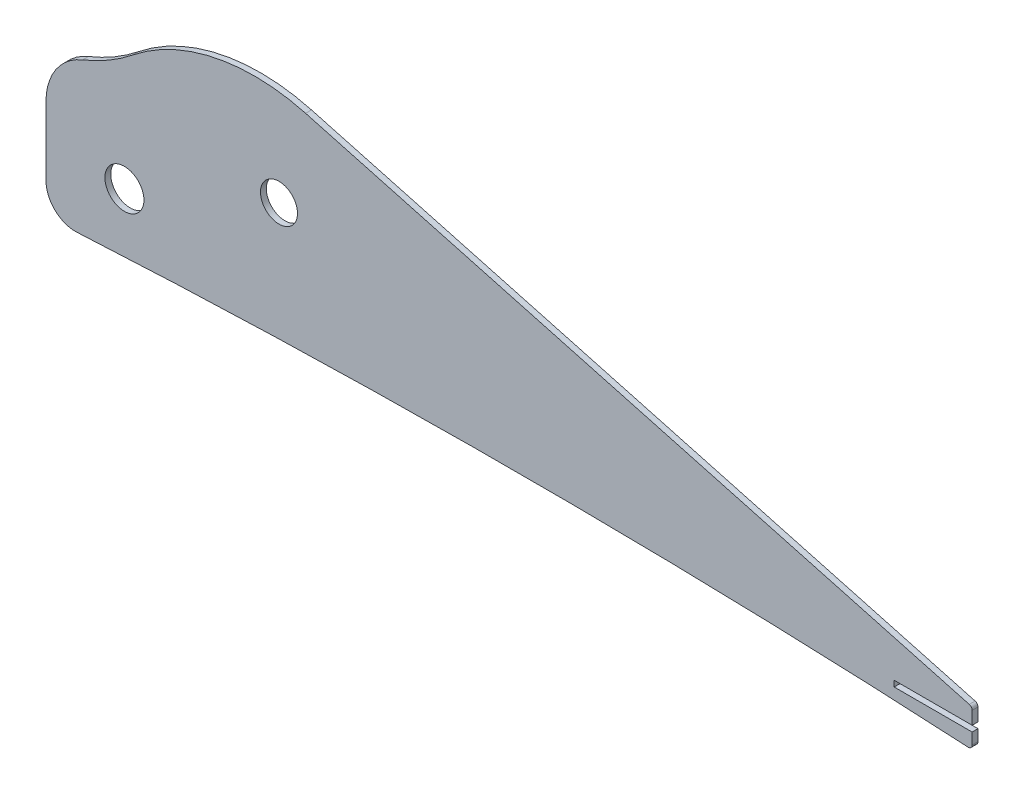
ISO-10303-21;
HEADER;
FILE_DESCRIPTION(('STEP AP214'),'2;1');
FILE_NAME('part.step','',(''),(''),'','','');
FILE_SCHEMA(('AUTOMOTIVE_DESIGN { 1 0 10303 214 1 1 1 1 }'));
ENDSEC;
DATA;
#1=APPLICATION_CONTEXT('core data for automotive mechanical design processes');
#2=APPLICATION_PROTOCOL_DEFINITION('international standard','automotive_design',2000,#1);
#3=PRODUCT_CONTEXT('',#1,'mechanical');
#4=PRODUCT('Part','Part','',(#3));
#5=PRODUCT_RELATED_PRODUCT_CATEGORY('part','',(#4));
#6=PRODUCT_DEFINITION_FORMATION('','',#4);
#7=PRODUCT_DEFINITION_CONTEXT('part definition',#1,'design');
#8=PRODUCT_DEFINITION('design','',#6,#7);
#9=PRODUCT_DEFINITION_SHAPE('','',#8);
#10=(LENGTH_UNIT() NAMED_UNIT(*) SI_UNIT(.MILLI.,.METRE.));
#11=(NAMED_UNIT(*) PLANE_ANGLE_UNIT() SI_UNIT($,.RADIAN.));
#12=(NAMED_UNIT(*) SI_UNIT($,.STERADIAN.) SOLID_ANGLE_UNIT());
#13=UNCERTAINTY_MEASURE_WITH_UNIT(LENGTH_MEASURE(1.E-05),#10,'distance_accuracy_value','');
#14=(GEOMETRIC_REPRESENTATION_CONTEXT(3) GLOBAL_UNCERTAINTY_ASSIGNED_CONTEXT((#13)) GLOBAL_UNIT_ASSIGNED_CONTEXT((#10,
#11,#12)) REPRESENTATION_CONTEXT('',''));
#15=CARTESIAN_POINT('',(0.,0.,0.));
#16=DIRECTION('',(0.,0.,1.));
#17=DIRECTION('',(1.,0.,0.));
#18=AXIS2_PLACEMENT_3D('',#15,#16,#17);
#19=CARTESIAN_POINT('',(450.000000000001,-42.109493016782,3.));
#20=DIRECTION('',(-1.,0.,0.));
#21=DIRECTION('',(0.,-1.,0.));
#22=AXIS2_PLACEMENT_3D('',#19,#20,#21);
#23=PLANE('',#22);
#24=DIRECTION('',(0.,1.,0.));
#25=VECTOR('',#24,1.);
#26=CARTESIAN_POINT('',(450.000000000001,-42.109493016782,0.));
#27=LINE('',#26,#25);
#28=CARTESIAN_POINT('',(450.000000000001,-42.109493016782,0.));
#29=VERTEX_POINT('',#28);
#30=CARTESIAN_POINT('',(450.000000000001,-36.3432898663785,0.));
#31=VERTEX_POINT('',#30);
#32=EDGE_CURVE('E186',#29,#31,#27,.T.);
#33=ORIENTED_EDGE('',*,*,#32,.T.);
#34=DIRECTION('',(0.,0.,1.));
#35=VECTOR('',#34,1.);
#36=CARTESIAN_POINT('',(450.000000000001,-36.3432898663785,0.));
#37=LINE('',#36,#35);
#38=CARTESIAN_POINT('',(450.000000000001,-36.3432898663785,3.));
#39=VERTEX_POINT('',#38);
#40=EDGE_CURVE('E249',#31,#39,#37,.T.);
#41=ORIENTED_EDGE('',*,*,#40,.T.);
#42=DIRECTION('',(0.,1.,0.));
#43=VECTOR('',#42,1.);
#44=CARTESIAN_POINT('',(450.000000000001,-42.109493016782,3.));
#45=LINE('',#44,#43);
#46=CARTESIAN_POINT('',(450.000000000001,-42.109493016782,3.));
#47=VERTEX_POINT('',#46);
#48=EDGE_CURVE('E150',#47,#39,#45,.T.);
#49=ORIENTED_EDGE('',*,*,#48,.F.);
#50=DIRECTION('',(0.,0.,-1.));
#51=VECTOR('',#50,1.);
#52=CARTESIAN_POINT('',(450.000000000001,-42.109493016782,3.));
#53=LINE('',#52,#51);
#54=EDGE_CURVE('E160',#47,#29,#53,.T.);
#55=ORIENTED_EDGE('',*,*,#54,.T.);
#56=EDGE_LOOP('',(#33,#41,#49,#55));
#57=FACE_BOUND('',#56,.T.);
#58=ADVANCED_FACE('F41',(#57),#23,.F.);
#59=CARTESIAN_POINT('',(81.9687686167285,-28.9584340125129,3.));
#60=DIRECTION('',(0.,0.,-1.));
#61=DIRECTION('',(-1.,0.,0.));
#62=AXIS2_PLACEMENT_3D('',#59,#60,#61);
#63=CYLINDRICAL_SURFACE('',#62,100.);
#64=CARTESIAN_POINT('',(81.9687686167285,-28.9584340125129,0.));
#65=DIRECTION('',(0.,0.,1.));
#66=DIRECTION('',(1.,0.,0.));
#67=AXIS2_PLACEMENT_3D('',#64,#65,#66);
#68=CIRCLE('',#67,100.);
#69=CARTESIAN_POINT('',(108.154123351422,67.5523280682947,0.));
#70=VERTEX_POINT('',#69);
#71=CARTESIAN_POINT('',(19.5156695534298,49.1415686596368,0.));
#72=VERTEX_POINT('',#71);
#73=EDGE_CURVE('E170',#70,#72,#68,.T.);
#74=ORIENTED_EDGE('',*,*,#73,.T.);
#75=DIRECTION('',(0.,0.,-1.));
#76=VECTOR('',#75,1.);
#77=CARTESIAN_POINT('',(19.5156695534298,49.1415686596368,3.));
#78=LINE('',#77,#76);
#79=CARTESIAN_POINT('',(19.5156695534298,49.1415686596368,3.));
#80=VERTEX_POINT('',#79);
#81=EDGE_CURVE('E11',#80,#72,#78,.T.);
#82=ORIENTED_EDGE('',*,*,#81,.F.);
#83=CARTESIAN_POINT('',(81.9687686167285,-28.9584340125129,3.));
#84=DIRECTION('',(0.,0.,1.));
#85=DIRECTION('',(1.,0.,0.));
#86=AXIS2_PLACEMENT_3D('',#83,#84,#85);
#87=CIRCLE('',#86,100.);
#88=CARTESIAN_POINT('',(108.154123351422,67.5523280682947,3.));
#89=VERTEX_POINT('',#88);
#90=EDGE_CURVE('E192',#89,#80,#87,.T.);
#91=ORIENTED_EDGE('',*,*,#90,.F.);
#92=DIRECTION('',(0.,0.,-1.));
#93=VECTOR('',#92,1.);
#94=CARTESIAN_POINT('',(108.154123351422,67.5523280682947,3.));
#95=LINE('',#94,#93);
#96=EDGE_CURVE('E165',#89,#70,#95,.T.);
#97=ORIENTED_EDGE('',*,*,#96,.T.);
#98=EDGE_LOOP('',(#74,#82,#91,#97));
#99=FACE_BOUND('',#98,.T.);
#100=ADVANCED_FACE('F43',(#99),#63,.T.);
#101=CARTESIAN_POINT('',(-44.8529201274795,129.63696602953,3.));
#102=DIRECTION('',(0.,0.,-1.));
#103=DIRECTION('',(-1.,0.,0.));
#104=AXIS2_PLACEMENT_3D('',#101,#102,#103);
#105=CYLINDRICAL_SURFACE('',#104,103.067086575911);
#106=CARTESIAN_POINT('',(-44.8529201274795,129.63696602953,0.));
#107=DIRECTION('',(0.,0.,-1.));
#108=DIRECTION('',(1.,0.,0.));
#109=AXIS2_PLACEMENT_3D('',#106,#107,#108);
#110=CIRCLE('',#109,103.067086575911);
#111=CARTESIAN_POINT('',(-6.23935033304476,34.0764272963448,0.));
#112=VERTEX_POINT('',#111);
#113=EDGE_CURVE('E173',#72,#112,#110,.T.);
#114=ORIENTED_EDGE('',*,*,#113,.T.);
#115=DIRECTION('',(0.,0.,-1.));
#116=VECTOR('',#115,1.);
#117=CARTESIAN_POINT('',(-6.23935033304476,34.0764272963448,3.));
#118=LINE('',#117,#116);
#119=CARTESIAN_POINT('',(-6.23935033304476,34.0764272963448,3.));
#120=VERTEX_POINT('',#119);
#121=EDGE_CURVE('E50',#120,#112,#118,.T.);
#122=ORIENTED_EDGE('',*,*,#121,.F.);
#123=CARTESIAN_POINT('',(-44.8529201274795,129.63696602953,3.));
#124=DIRECTION('',(0.,0.,-1.));
#125=DIRECTION('',(1.,0.,0.));
#126=AXIS2_PLACEMENT_3D('',#123,#124,#125);
#127=CIRCLE('',#126,103.067086575911);
#128=EDGE_CURVE('E113',#80,#120,#127,.T.);
#129=ORIENTED_EDGE('',*,*,#128,.F.);
#130=ORIENTED_EDGE('',*,*,#81,.T.);
#131=EDGE_LOOP('',(#114,#122,#129,#130));
#132=FACE_BOUND('',#131,.T.);
#133=ADVANCED_FACE('F279',(#132),#105,.F.);
#134=CARTESIAN_POINT('',(5.00000000000125,6.26137733969261,3.));
#135=DIRECTION('',(0.,0.,-1.));
#136=DIRECTION('',(-1.,0.,0.));
#137=AXIS2_PLACEMENT_3D('',#134,#135,#136);
#138=CYLINDRICAL_SURFACE('',#137,30.);
#139=CARTESIAN_POINT('',(5.00000000000125,6.26137733969261,0.));
#140=DIRECTION('',(0.,0.,1.));
#141=DIRECTION('',(1.,0.,0.));
#142=AXIS2_PLACEMENT_3D('',#139,#140,#141);
#143=CIRCLE('',#142,30.);
#144=CARTESIAN_POINT('',(-24.9999999999987,6.26137733969261,0.));
#145=VERTEX_POINT('',#144);
#146=EDGE_CURVE('E176',#112,#145,#143,.T.);
#147=ORIENTED_EDGE('',*,*,#146,.T.);
#148=DIRECTION('',(0.,0.,-1.));
#149=VECTOR('',#148,1.);
#150=CARTESIAN_POINT('',(-24.9999999999987,6.26137733969261,3.));
#151=LINE('',#150,#149);
#152=CARTESIAN_POINT('',(-24.9999999999987,6.26137733969261,3.));
#153=VERTEX_POINT('',#152);
#154=EDGE_CURVE('E206',#153,#145,#151,.T.);
#155=ORIENTED_EDGE('',*,*,#154,.F.);
#156=CARTESIAN_POINT('',(5.00000000000125,6.26137733969261,3.));
#157=DIRECTION('',(0.,0.,1.));
#158=DIRECTION('',(1.,0.,0.));
#159=AXIS2_PLACEMENT_3D('',#156,#157,#158);
#160=CIRCLE('',#159,30.);
#161=EDGE_CURVE('E215',#120,#153,#160,.T.);
#162=ORIENTED_EDGE('',*,*,#161,.F.);
#163=ORIENTED_EDGE('',*,*,#121,.T.);
#164=EDGE_LOOP('',(#147,#155,#162,#163));
#165=FACE_BOUND('',#164,.T.);
#166=ADVANCED_FACE('F213',(#165),#138,.T.);
#167=CARTESIAN_POINT('',(-24.9999999999987,-28.9651853696142,3.));
#168=DIRECTION('',(1.,0.,0.));
#169=DIRECTION('',(0.,0.,-1.));
#170=AXIS2_PLACEMENT_3D('',#167,#168,#169);
#171=PLANE('',#170);
#172=DIRECTION('',(0.,-1.,0.));
#173=VECTOR('',#172,1.);
#174=CARTESIAN_POINT('',(-24.9999999999987,-28.9651853696142,0.));
#175=LINE('',#174,#173);
#176=CARTESIAN_POINT('',(-24.9999999999988,-28.9651853696142,0.));
#177=VERTEX_POINT('',#176);
#178=EDGE_CURVE('E178',#145,#177,#175,.T.);
#179=ORIENTED_EDGE('',*,*,#178,.T.);
#180=DIRECTION('',(0.,0.,-1.));
#181=VECTOR('',#180,1.);
#182=CARTESIAN_POINT('',(-24.9999999999988,-28.9651853696142,3.));
#183=LINE('',#182,#181);
#184=CARTESIAN_POINT('',(-24.9999999999988,-28.9651853696142,3.));
#185=VERTEX_POINT('',#184);
#186=EDGE_CURVE('E203',#185,#177,#183,.T.);
#187=ORIENTED_EDGE('',*,*,#186,.F.);
#188=DIRECTION('',(0.,-1.,0.));
#189=VECTOR('',#188,1.);
#190=CARTESIAN_POINT('',(-24.9999999999987,-28.9651853696142,3.));
#191=LINE('',#190,#189);
#192=EDGE_CURVE('E233',#153,#185,#191,.T.);
#193=ORIENTED_EDGE('',*,*,#192,.F.);
#194=ORIENTED_EDGE('',*,*,#154,.T.);
#195=EDGE_LOOP('',(#179,#187,#193,#194));
#196=FACE_BOUND('',#195,.T.);
#197=ADVANCED_FACE('F224',(#196),#171,.F.);
#198=CARTESIAN_POINT('',(-9.99999999999876,-28.9651853696142,3.));
#199=DIRECTION('',(0.,0.,-1.));
#200=DIRECTION('',(-1.,0.,0.));
#201=AXIS2_PLACEMENT_3D('',#198,#199,#200);
#202=CYLINDRICAL_SURFACE('',#201,15.);
#203=CARTESIAN_POINT('',(-9.99999999999876,-28.9651853696142,0.));
#204=DIRECTION('',(0.,0.,1.));
#205=DIRECTION('',(-1.,0.,0.));
#206=AXIS2_PLACEMENT_3D('',#203,#204,#205);
#207=CIRCLE('',#206,15.);
#208=CARTESIAN_POINT('',(-9.16962043075212,-43.9421833922813,0.));
#209=VERTEX_POINT('',#208);
#210=EDGE_CURVE('E180',#177,#209,#207,.T.);
#211=ORIENTED_EDGE('',*,*,#210,.T.);
#212=DIRECTION('',(0.,0.,-1.));
#213=VECTOR('',#212,1.);
#214=CARTESIAN_POINT('',(-9.16962043075212,-43.9421833922813,3.));
#215=LINE('',#214,#213);
#216=CARTESIAN_POINT('',(-9.16962043075212,-43.9421833922813,3.));
#217=VERTEX_POINT('',#216);
#218=EDGE_CURVE('E200',#217,#209,#215,.T.);
#219=ORIENTED_EDGE('',*,*,#218,.F.);
#220=CARTESIAN_POINT('',(-9.99999999999876,-28.9651853696142,3.));
#221=DIRECTION('',(0.,0.,1.));
#222=DIRECTION('',(-1.,0.,0.));
#223=AXIS2_PLACEMENT_3D('',#220,#221,#222);
#224=CIRCLE('',#223,15.);
#225=EDGE_CURVE('E230',#185,#217,#224,.T.);
#226=ORIENTED_EDGE('',*,*,#225,.F.);
#227=ORIENTED_EDGE('',*,*,#186,.T.);
#228=EDGE_LOOP('',(#211,#219,#226,#227));
#229=FACE_BOUND('',#228,.T.);
#230=ADVANCED_FACE('F228',(#229),#202,.T.);
#231=CARTESIAN_POINT('',(217.888226405949,-4139.23191479768,3.));
#232=DIRECTION('',(0.,0.,-1.));
#233=DIRECTION('',(-1.,0.,0.));
#234=AXIS2_PLACEMENT_3D('',#231,#232,#233);
#235=CYLINDRICAL_SURFACE('',#234,4101.57936043722);
#236=CARTESIAN_POINT('',(217.888226405949,-4139.23191479768,0.));
#237=DIRECTION('',(0.,0.,-1.));
#238=DIRECTION('',(-1.,0.,0.));
#239=AXIS2_PLACEMENT_3D('',#236,#237,#238);
#240=CIRCLE('',#239,4101.57936043722);
#241=CARTESIAN_POINT('',(447.887848264464,-44.1063460379672,0.));
#242=VERTEX_POINT('',#241);
#243=EDGE_CURVE('E182',#209,#242,#240,.T.);
#244=ORIENTED_EDGE('',*,*,#243,.T.);
#245=DIRECTION('',(0.,0.,-1.));
#246=VECTOR('',#245,1.);
#247=CARTESIAN_POINT('',(447.887848264464,-44.1063460379672,3.));
#248=LINE('',#247,#246);
#249=CARTESIAN_POINT('',(447.887848264464,-44.1063460379672,3.));
#250=VERTEX_POINT('',#249);
#251=EDGE_CURVE('E197',#250,#242,#248,.T.);
#252=ORIENTED_EDGE('',*,*,#251,.F.);
#253=CARTESIAN_POINT('',(217.888226405949,-4139.23191479768,3.));
#254=DIRECTION('',(0.,0.,-1.));
#255=DIRECTION('',(-1.,0.,0.));
#256=AXIS2_PLACEMENT_3D('',#253,#254,#255);
#257=CIRCLE('',#256,4101.57936043722);
#258=EDGE_CURVE('E232',#217,#250,#257,.T.);
#259=ORIENTED_EDGE('',*,*,#258,.F.);
#260=ORIENTED_EDGE('',*,*,#218,.T.);
#261=EDGE_LOOP('',(#244,#252,#259,#260));
#262=FACE_BOUND('',#261,.T.);
#263=ADVANCED_FACE('F300',(#262),#235,.F.);
#264=CARTESIAN_POINT('',(448.000000000001,-42.109493016782,3.));
#265=DIRECTION('',(0.,0.,-1.));
#266=DIRECTION('',(-1.,0.,0.));
#267=AXIS2_PLACEMENT_3D('',#264,#265,#266);
#268=CYLINDRICAL_SURFACE('',#267,2.00000000000009);
#269=CARTESIAN_POINT('',(448.000000000001,-42.109493016782,0.));
#270=DIRECTION('',(0.,0.,1.));
#271=DIRECTION('',(1.,0.,0.));
#272=AXIS2_PLACEMENT_3D('',#269,#270,#271);
#273=CIRCLE('',#272,2.00000000000009);
#274=EDGE_CURVE('E184',#242,#29,#273,.T.);
#275=ORIENTED_EDGE('',*,*,#274,.T.);
#276=ORIENTED_EDGE('',*,*,#54,.F.);
#277=CARTESIAN_POINT('',(448.000000000001,-42.109493016782,3.));
#278=DIRECTION('',(0.,0.,1.));
#279=DIRECTION('',(1.,0.,0.));
#280=AXIS2_PLACEMENT_3D('',#277,#278,#279);
#281=CIRCLE('',#280,2.00000000000009);
#282=EDGE_CURVE('E151',#250,#47,#281,.T.);
#283=ORIENTED_EDGE('',*,*,#282,.F.);
#284=ORIENTED_EDGE('',*,*,#251,.T.);
#285=EDGE_LOOP('',(#275,#276,#283,#284));
#286=FACE_BOUND('',#285,.T.);
#287=ADVANCED_FACE('F243',(#286),#268,.T.);
#288=CARTESIAN_POINT('',(450.000000000001,-33.3432898663785,3.));
#289=VERTEX_POINT('',#288);
#290=CARTESIAN_POINT('',(450.000000000001,-26.7271557839573,3.));
#291=VERTEX_POINT('',#290);
#292=EDGE_CURVE('E136',#289,#291,#45,.T.);
#293=ORIENTED_EDGE('',*,*,#292,.F.);
#294=DIRECTION('',(0.,0.,1.));
#295=VECTOR('',#294,1.);
#296=CARTESIAN_POINT('',(450.000000000001,-33.3432898663785,0.));
#297=LINE('',#296,#295);
#298=CARTESIAN_POINT('',(450.000000000001,-33.3432898663785,0.));
#299=VERTEX_POINT('',#298);
#300=EDGE_CURVE('E269',#299,#289,#297,.T.);
#301=ORIENTED_EDGE('',*,*,#300,.F.);
#302=CARTESIAN_POINT('',(450.000000000001,-26.7271557839573,0.));
#303=VERTEX_POINT('',#302);
#304=EDGE_CURVE('E157',#299,#303,#27,.T.);
#305=ORIENTED_EDGE('',*,*,#304,.T.);
#306=DIRECTION('',(0.,0.,-1.));
#307=VECTOR('',#306,1.);
#308=CARTESIAN_POINT('',(450.000000000001,-26.7271557839573,3.));
#309=LINE('',#308,#307);
#310=EDGE_CURVE('E154',#291,#303,#309,.T.);
#311=ORIENTED_EDGE('',*,*,#310,.F.);
#312=EDGE_LOOP('',(#293,#301,#305,#311));
#313=FACE_BOUND('',#312,.T.);
#314=ADVANCED_FACE('F155',(#313),#23,.F.);
#315=CARTESIAN_POINT('',(448.000000000001,-26.7271557839573,3.));
#316=DIRECTION('',(0.,0.,-1.));
#317=DIRECTION('',(-1.,0.,0.));
#318=AXIS2_PLACEMENT_3D('',#315,#316,#317);
#319=CYLINDRICAL_SURFACE('',#318,2.);
#320=CARTESIAN_POINT('',(448.000000000001,-26.7271557839573,0.));
#321=DIRECTION('',(0.,0.,1.));
#322=DIRECTION('',(1.,0.,0.));
#323=AXIS2_PLACEMENT_3D('',#320,#321,#322);
#324=CIRCLE('',#323,2.);
#325=CARTESIAN_POINT('',(448.523707094695,-24.7969405423412,0.));
#326=VERTEX_POINT('',#325);
#327=EDGE_CURVE('E189',#303,#326,#324,.T.);
#328=ORIENTED_EDGE('',*,*,#327,.T.);
#329=DIRECTION('',(0.,0.,-1.));
#330=VECTOR('',#329,1.);
#331=CARTESIAN_POINT('',(448.523707094695,-24.7969405423412,3.));
#332=LINE('',#331,#330);
#333=CARTESIAN_POINT('',(448.523707094695,-24.7969405423412,3.));
#334=VERTEX_POINT('',#333);
#335=EDGE_CURVE('E161',#334,#326,#332,.T.);
#336=ORIENTED_EDGE('',*,*,#335,.F.);
#337=CARTESIAN_POINT('',(448.000000000001,-26.7271557839573,3.));
#338=DIRECTION('',(0.,0.,1.));
#339=DIRECTION('',(1.,0.,0.));
#340=AXIS2_PLACEMENT_3D('',#337,#338,#339);
#341=CIRCLE('',#340,2.);
#342=EDGE_CURVE('E142',#291,#334,#341,.T.);
#343=ORIENTED_EDGE('',*,*,#342,.F.);
#344=ORIENTED_EDGE('',*,*,#310,.T.);
#345=EDGE_LOOP('',(#328,#336,#343,#344));
#346=FACE_BOUND('',#345,.T.);
#347=ADVANCED_FACE('F163',(#346),#319,.T.);
#348=CARTESIAN_POINT('',(108.154123351422,67.5523280682947,3.));
#349=DIRECTION('',(-0.261853547346938,-0.965107620808076,0.));
#350=DIRECTION('',(0.965107620808076,-0.261853547346938,0.));
#351=AXIS2_PLACEMENT_3D('',#348,#349,#350);
#352=PLANE('',#351);
#353=DIRECTION('',(-0.965107620808076,0.261853547346938,0.));
#354=VECTOR('',#353,1.);
#355=CARTESIAN_POINT('',(108.154123351422,67.5523280682947,0.));
#356=LINE('',#355,#354);
#357=EDGE_CURVE('E105',#326,#70,#356,.T.);
#358=ORIENTED_EDGE('',*,*,#357,.T.);
#359=ORIENTED_EDGE('',*,*,#96,.F.);
#360=DIRECTION('',(-0.965107620808076,0.261853547346938,0.));
#361=VECTOR('',#360,1.);
#362=CARTESIAN_POINT('',(108.154123351422,67.5523280682947,3.));
#363=LINE('',#362,#361);
#364=EDGE_CURVE('E66',#334,#89,#363,.T.);
#365=ORIENTED_EDGE('',*,*,#364,.F.);
#366=ORIENTED_EDGE('',*,*,#335,.T.);
#367=EDGE_LOOP('',(#358,#359,#365,#366));
#368=FACE_BOUND('',#367,.T.);
#369=ADVANCED_FACE('F298',(#368),#352,.F.);
#370=CARTESIAN_POINT('',(81.9687686167285,-28.9584340125129,3.));
#371=DIRECTION('',(0.,0.,1.));
#372=DIRECTION('',(1.,0.,0.));
#373=AXIS2_PLACEMENT_3D('',#370,#371,#372);
#374=PLANE('',#373);
#375=CARTESIAN_POINT('',(15.2117765311485,-12.4749755970572,3.));
#376=DIRECTION('',(0.,0.,1.));
#377=DIRECTION('',(1.,0.,0.));
#378=AXIS2_PLACEMENT_3D('',#375,#376,#377);
#379=CIRCLE('',#378,10.);
#380=CARTESIAN_POINT('',(25.2117765311485,-12.4749755970572,3.));
#381=VERTEX_POINT('',#380);
#382=EDGE_CURVE('E421',#381,#381,#379,.T.);
#383=ORIENTED_EDGE('',*,*,#382,.F.);
#384=EDGE_LOOP('',(#383));
#385=FACE_BOUND('',#384,.T.);
#386=DIRECTION('',(1.,0.,0.));
#387=VECTOR('',#386,1.);
#388=CARTESIAN_POINT('',(450.000000000001,-36.3432898663785,3.));
#389=LINE('',#388,#387);
#390=CARTESIAN_POINT('',(410.000000000001,-36.3432898663785,3.));
#391=VERTEX_POINT('',#390);
#392=EDGE_CURVE('E265',#391,#39,#389,.T.);
#393=ORIENTED_EDGE('',*,*,#392,.F.);
#394=DIRECTION('',(0.,-1.,0.));
#395=VECTOR('',#394,1.);
#396=CARTESIAN_POINT('',(410.000000000001,-36.3432898663785,3.));
#397=LINE('',#396,#395);
#398=CARTESIAN_POINT('',(410.000000000001,-33.3432898663785,3.));
#399=VERTEX_POINT('',#398);
#400=EDGE_CURVE('E424',#399,#391,#397,.T.);
#401=ORIENTED_EDGE('',*,*,#400,.F.);
#402=DIRECTION('',(-1.,0.,0.));
#403=VECTOR('',#402,1.);
#404=CARTESIAN_POINT('',(450.000000000001,-33.3432898663785,3.));
#405=LINE('',#404,#403);
#406=EDGE_CURVE('E147',#289,#399,#405,.T.);
#407=ORIENTED_EDGE('',*,*,#406,.F.);
#408=ORIENTED_EDGE('',*,*,#292,.T.);
#409=ORIENTED_EDGE('',*,*,#342,.T.);
#410=ORIENTED_EDGE('',*,*,#364,.T.);
#411=ORIENTED_EDGE('',*,*,#90,.T.);
#412=ORIENTED_EDGE('',*,*,#128,.T.);
#413=ORIENTED_EDGE('',*,*,#161,.T.);
#414=ORIENTED_EDGE('',*,*,#192,.T.);
#415=ORIENTED_EDGE('',*,*,#225,.T.);
#416=ORIENTED_EDGE('',*,*,#258,.T.);
#417=ORIENTED_EDGE('',*,*,#282,.T.);
#418=ORIENTED_EDGE('',*,*,#48,.T.);
#419=EDGE_LOOP('',(#393,#401,#407,#408,#409,#410,#411,#412,#413,#414,#415,#416,#417,#418));
#420=FACE_BOUND('',#419,.T.);
#421=CARTESIAN_POINT('',(94.5,21.0000000000009,3.));
#422=DIRECTION('',(0.,0.,1.));
#423=DIRECTION('',(1.,0.,0.));
#424=AXIS2_PLACEMENT_3D('',#421,#422,#423);
#425=CIRCLE('',#424,9.49999999999999);
#426=CARTESIAN_POINT('',(104.,21.0000000000009,3.));
#427=VERTEX_POINT('',#426);
#428=EDGE_CURVE('E256',#427,#427,#425,.T.);
#429=ORIENTED_EDGE('',*,*,#428,.F.);
#430=EDGE_LOOP('',(#429));
#431=FACE_BOUND('',#430,.T.);
#432=ADVANCED_FACE('F139',(#385,#420,#431),#374,.T.);
#433=CARTESIAN_POINT('',(81.9687686167285,-28.9584340125129,0.));
#434=DIRECTION('',(0.,0.,1.));
#435=DIRECTION('',(1.,0.,0.));
#436=AXIS2_PLACEMENT_3D('',#433,#434,#435);
#437=PLANE('',#436);
#438=CARTESIAN_POINT('',(15.2117765311485,-12.4749755970572,0.));
#439=DIRECTION('',(0.,0.,1.));
#440=DIRECTION('',(1.,0.,0.));
#441=AXIS2_PLACEMENT_3D('',#438,#439,#440);
#442=CIRCLE('',#441,10.);
#443=CARTESIAN_POINT('',(25.2117765311485,-12.4749755970572,0.));
#444=VERTEX_POINT('',#443);
#445=EDGE_CURVE('E45',#444,#444,#442,.T.);
#446=ORIENTED_EDGE('',*,*,#445,.T.);
#447=EDGE_LOOP('',(#446));
#448=FACE_BOUND('',#447,.T.);
#449=CARTESIAN_POINT('',(94.5,21.0000000000009,0.));
#450=DIRECTION('',(0.,0.,1.));
#451=DIRECTION('',(1.,0.,0.));
#452=AXIS2_PLACEMENT_3D('',#449,#450,#451);
#453=CIRCLE('',#452,9.49999999999999);
#454=CARTESIAN_POINT('',(104.,21.0000000000009,0.));
#455=VERTEX_POINT('',#454);
#456=EDGE_CURVE('E174',#455,#455,#453,.T.);
#457=ORIENTED_EDGE('',*,*,#456,.T.);
#458=EDGE_LOOP('',(#457));
#459=FACE_BOUND('',#458,.T.);
#460=DIRECTION('',(0.,-1.,0.));
#461=VECTOR('',#460,1.);
#462=CARTESIAN_POINT('',(410.000000000001,-36.3432898663785,0.));
#463=LINE('',#462,#461);
#464=CARTESIAN_POINT('',(410.000000000001,-33.3432898663785,0.));
#465=VERTEX_POINT('',#464);
#466=CARTESIAN_POINT('',(410.000000000001,-36.3432898663785,0.));
#467=VERTEX_POINT('',#466);
#468=EDGE_CURVE('E57',#465,#467,#463,.T.);
#469=ORIENTED_EDGE('',*,*,#468,.T.);
#470=DIRECTION('',(1.,0.,0.));
#471=VECTOR('',#470,1.);
#472=CARTESIAN_POINT('',(450.000000000001,-36.3432898663785,0.));
#473=LINE('',#472,#471);
#474=EDGE_CURVE('E272',#467,#31,#473,.T.);
#475=ORIENTED_EDGE('',*,*,#474,.T.);
#476=ORIENTED_EDGE('',*,*,#32,.F.);
#477=ORIENTED_EDGE('',*,*,#274,.F.);
#478=ORIENTED_EDGE('',*,*,#243,.F.);
#479=ORIENTED_EDGE('',*,*,#210,.F.);
#480=ORIENTED_EDGE('',*,*,#178,.F.);
#481=ORIENTED_EDGE('',*,*,#146,.F.);
#482=ORIENTED_EDGE('',*,*,#113,.F.);
#483=ORIENTED_EDGE('',*,*,#73,.F.);
#484=ORIENTED_EDGE('',*,*,#357,.F.);
#485=ORIENTED_EDGE('',*,*,#327,.F.);
#486=ORIENTED_EDGE('',*,*,#304,.F.);
#487=DIRECTION('',(-1.,0.,0.));
#488=VECTOR('',#487,1.);
#489=CARTESIAN_POINT('',(450.000000000001,-33.3432898663785,0.));
#490=LINE('',#489,#488);
#491=EDGE_CURVE('E428',#299,#465,#490,.T.);
#492=ORIENTED_EDGE('',*,*,#491,.T.);
#493=EDGE_LOOP('',(#469,#475,#476,#477,#478,#479,#480,#481,#482,#483,#484,#485,#486,#492));
#494=FACE_BOUND('',#493,.T.);
#495=ADVANCED_FACE('F218',(#448,#459,#494),#437,.F.);
#496=CARTESIAN_POINT('',(94.5,21.0000000000009,0.));
#497=DIRECTION('',(0.,0.,1.));
#498=DIRECTION('',(1.,0.,0.));
#499=AXIS2_PLACEMENT_3D('',#496,#497,#498);
#500=CYLINDRICAL_SURFACE('',#499,9.49999999999999);
#501=ORIENTED_EDGE('',*,*,#456,.F.);
#502=EDGE_LOOP('',(#501));
#503=FACE_BOUND('',#502,.T.);
#504=ORIENTED_EDGE('',*,*,#428,.T.);
#505=EDGE_LOOP('',(#504));
#506=FACE_BOUND('',#505,.T.);
#507=ADVANCED_FACE('F366',(#503,#506),#500,.F.);
#508=CARTESIAN_POINT('',(450.000000000001,-36.3432898663785,0.));
#509=DIRECTION('',(0.,-1.,0.));
#510=DIRECTION('',(1.,0.,0.));
#511=AXIS2_PLACEMENT_3D('',#508,#509,#510);
#512=PLANE('',#511);
#513=ORIENTED_EDGE('',*,*,#392,.T.);
#514=ORIENTED_EDGE('',*,*,#40,.F.);
#515=ORIENTED_EDGE('',*,*,#474,.F.);
#516=DIRECTION('',(0.,0.,1.));
#517=VECTOR('',#516,1.);
#518=CARTESIAN_POINT('',(410.000000000001,-36.3432898663785,0.));
#519=LINE('',#518,#517);
#520=EDGE_CURVE('E257',#467,#391,#519,.T.);
#521=ORIENTED_EDGE('',*,*,#520,.T.);
#522=EDGE_LOOP('',(#513,#514,#515,#521));
#523=FACE_BOUND('',#522,.T.);
#524=ADVANCED_FACE('F376',(#523),#512,.F.);
#525=CARTESIAN_POINT('',(410.000000000001,-36.3432898663785,0.));
#526=DIRECTION('',(-1.,0.,0.));
#527=DIRECTION('',(0.,0.,1.));
#528=AXIS2_PLACEMENT_3D('',#525,#526,#527);
#529=PLANE('',#528);
#530=ORIENTED_EDGE('',*,*,#400,.T.);
#531=ORIENTED_EDGE('',*,*,#520,.F.);
#532=ORIENTED_EDGE('',*,*,#468,.F.);
#533=DIRECTION('',(0.,0.,1.));
#534=VECTOR('',#533,1.);
#535=CARTESIAN_POINT('',(410.000000000001,-33.3432898663785,0.));
#536=LINE('',#535,#534);
#537=EDGE_CURVE('E262',#465,#399,#536,.T.);
#538=ORIENTED_EDGE('',*,*,#537,.T.);
#539=EDGE_LOOP('',(#530,#531,#532,#538));
#540=FACE_BOUND('',#539,.T.);
#541=ADVANCED_FACE('F389',(#540),#529,.F.);
#542=CARTESIAN_POINT('',(450.000000000001,-33.3432898663785,0.));
#543=DIRECTION('',(0.,1.,0.));
#544=DIRECTION('',(-1.,0.,0.));
#545=AXIS2_PLACEMENT_3D('',#542,#543,#544);
#546=PLANE('',#545);
#547=ORIENTED_EDGE('',*,*,#406,.T.);
#548=ORIENTED_EDGE('',*,*,#537,.F.);
#549=ORIENTED_EDGE('',*,*,#491,.F.);
#550=ORIENTED_EDGE('',*,*,#300,.T.);
#551=EDGE_LOOP('',(#547,#548,#549,#550));
#552=FACE_BOUND('',#551,.T.);
#553=ADVANCED_FACE('F398',(#552),#546,.F.);
#554=CARTESIAN_POINT('',(15.2117765311485,-12.4749755970572,-7.));
#555=DIRECTION('',(0.,0.,1.));
#556=DIRECTION('',(1.,0.,0.));
#557=AXIS2_PLACEMENT_3D('',#554,#555,#556);
#558=CYLINDRICAL_SURFACE('',#557,10.);
#559=ORIENTED_EDGE('',*,*,#382,.T.);
#560=EDGE_LOOP('',(#559));
#561=FACE_BOUND('',#560,.T.);
#562=ORIENTED_EDGE('',*,*,#445,.F.);
#563=EDGE_LOOP('',(#562));
#564=FACE_BOUND('',#563,.T.);
#565=ADVANCED_FACE('F406',(#561,#564),#558,.F.);
#566=CLOSED_SHELL('',(#58,#100,#133,#166,#197,#230,#263,#287,#314,#347,#369,#432,#495,#507,#524,
#541,#553,#565));
#567=MANIFOLD_SOLID_BREP('B2',#566);
#568=ADVANCED_BREP_SHAPE_REPRESENTATION('',(#18,#567),#14);
#569=SHAPE_DEFINITION_REPRESENTATION(#9,#568);
ENDSEC;
END-ISO-10303-21;
